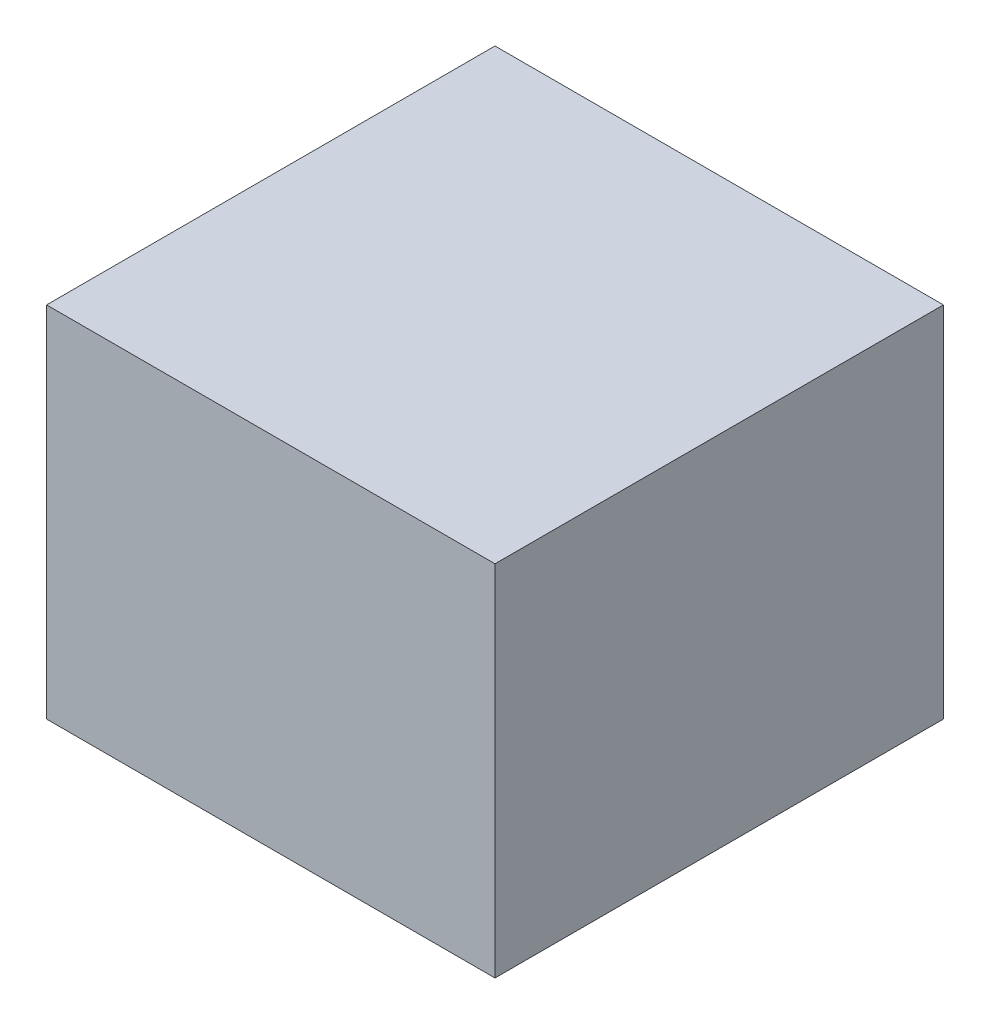
ISO-10303-21;
HEADER;
FILE_DESCRIPTION(('STEP AP214'),'2;1');
FILE_NAME('part.step','',(''),(''),'','','');
FILE_SCHEMA(('AUTOMOTIVE_DESIGN { 1 0 10303 214 1 1 1 1 }'));
ENDSEC;
DATA;
#1=APPLICATION_CONTEXT('core data for automotive mechanical design processes');
#2=APPLICATION_PROTOCOL_DEFINITION('international standard','automotive_design',2000,#1);
#3=PRODUCT_CONTEXT('',#1,'mechanical');
#4=PRODUCT('Part','Part','',(#3));
#5=PRODUCT_RELATED_PRODUCT_CATEGORY('part','',(#4));
#6=PRODUCT_DEFINITION_FORMATION('','',#4);
#7=PRODUCT_DEFINITION_CONTEXT('part definition',#1,'design');
#8=PRODUCT_DEFINITION('design','',#6,#7);
#9=PRODUCT_DEFINITION_SHAPE('','',#8);
#10=(LENGTH_UNIT() NAMED_UNIT(*) SI_UNIT(.MILLI.,.METRE.));
#11=(NAMED_UNIT(*) PLANE_ANGLE_UNIT() SI_UNIT($,.RADIAN.));
#12=(NAMED_UNIT(*) SI_UNIT($,.STERADIAN.) SOLID_ANGLE_UNIT());
#13=UNCERTAINTY_MEASURE_WITH_UNIT(LENGTH_MEASURE(1.E-05),#10,'distance_accuracy_value','');
#14=(GEOMETRIC_REPRESENTATION_CONTEXT(3) GLOBAL_UNCERTAINTY_ASSIGNED_CONTEXT((#13)) GLOBAL_UNIT_ASSIGNED_CONTEXT((#10,
#11,#12)) REPRESENTATION_CONTEXT('',''));
#15=CARTESIAN_POINT('',(0.,0.,0.));
#16=DIRECTION('',(0.,0.,1.));
#17=DIRECTION('',(1.,0.,0.));
#18=AXIS2_PLACEMENT_3D('',#15,#16,#17);
#19=CARTESIAN_POINT('',(-25.,40.,-25.));
#20=DIRECTION('',(1.,0.,0.));
#21=DIRECTION('',(0.,0.,-1.));
#22=AXIS2_PLACEMENT_3D('',#19,#20,#21);
#23=PLANE('',#22);
#24=DIRECTION('',(0.,0.,1.));
#25=VECTOR('',#24,1.);
#26=CARTESIAN_POINT('',(-25.,0.,-25.));
#27=LINE('',#26,#25);
#28=CARTESIAN_POINT('',(-25.,0.,-25.));
#29=VERTEX_POINT('',#28);
#30=CARTESIAN_POINT('',(-25.,0.,25.));
#31=VERTEX_POINT('',#30);
#32=EDGE_CURVE('E107',#29,#31,#27,.T.);
#33=ORIENTED_EDGE('',*,*,#32,.T.);
#34=DIRECTION('',(0.,-1.,0.));
#35=VECTOR('',#34,1.);
#36=CARTESIAN_POINT('',(-25.,40.,25.));
#37=LINE('',#36,#35);
#38=CARTESIAN_POINT('',(-25.,40.,25.));
#39=VERTEX_POINT('',#38);
#40=EDGE_CURVE('E11',#39,#31,#37,.T.);
#41=ORIENTED_EDGE('',*,*,#40,.F.);
#42=DIRECTION('',(0.,0.,1.));
#43=VECTOR('',#42,1.);
#44=CARTESIAN_POINT('',(-25.,40.,-25.));
#45=LINE('',#44,#43);
#46=CARTESIAN_POINT('',(-25.,40.,-25.));
#47=VERTEX_POINT('',#46);
#48=EDGE_CURVE('E92',#47,#39,#45,.T.);
#49=ORIENTED_EDGE('',*,*,#48,.F.);
#50=DIRECTION('',(0.,-1.,0.));
#51=VECTOR('',#50,1.);
#52=CARTESIAN_POINT('',(-25.,40.,-25.));
#53=LINE('',#52,#51);
#54=EDGE_CURVE('E105',#47,#29,#53,.T.);
#55=ORIENTED_EDGE('',*,*,#54,.T.);
#56=EDGE_LOOP('',(#33,#41,#49,#55));
#57=FACE_BOUND('',#56,.T.);
#58=ADVANCED_FACE('F43',(#57),#23,.F.);
#59=CARTESIAN_POINT('',(-25.,40.,25.));
#60=DIRECTION('',(0.,0.,-1.));
#61=DIRECTION('',(-1.,0.,0.));
#62=AXIS2_PLACEMENT_3D('',#59,#60,#61);
#63=PLANE('',#62);
#64=DIRECTION('',(1.,0.,0.));
#65=VECTOR('',#64,1.);
#66=CARTESIAN_POINT('',(-25.,0.,25.));
#67=LINE('',#66,#65);
#68=CARTESIAN_POINT('',(25.,0.,25.));
#69=VERTEX_POINT('',#68);
#70=EDGE_CURVE('E97',#31,#69,#67,.T.);
#71=ORIENTED_EDGE('',*,*,#70,.T.);
#72=DIRECTION('',(0.,-1.,0.));
#73=VECTOR('',#72,1.);
#74=CARTESIAN_POINT('',(25.,40.,25.));
#75=LINE('',#74,#73);
#76=CARTESIAN_POINT('',(25.,40.,25.));
#77=VERTEX_POINT('',#76);
#78=EDGE_CURVE('E51',#77,#69,#75,.T.);
#79=ORIENTED_EDGE('',*,*,#78,.F.);
#80=DIRECTION('',(1.,0.,0.));
#81=VECTOR('',#80,1.);
#82=CARTESIAN_POINT('',(-25.,40.,25.));
#83=LINE('',#82,#81);
#84=EDGE_CURVE('E87',#39,#77,#83,.T.);
#85=ORIENTED_EDGE('',*,*,#84,.F.);
#86=ORIENTED_EDGE('',*,*,#40,.T.);
#87=EDGE_LOOP('',(#71,#79,#85,#86));
#88=FACE_BOUND('',#87,.T.);
#89=ADVANCED_FACE('F100',(#88),#63,.F.);
#90=CARTESIAN_POINT('',(25.,40.,25.));
#91=DIRECTION('',(-1.,0.,0.));
#92=DIRECTION('',(0.,0.,1.));
#93=AXIS2_PLACEMENT_3D('',#90,#91,#92);
#94=PLANE('',#93);
#95=DIRECTION('',(0.,0.,-1.));
#96=VECTOR('',#95,1.);
#97=CARTESIAN_POINT('',(25.,0.,25.));
#98=LINE('',#97,#96);
#99=CARTESIAN_POINT('',(25.,0.,-25.));
#100=VERTEX_POINT('',#99);
#101=EDGE_CURVE('E78',#69,#100,#98,.T.);
#102=ORIENTED_EDGE('',*,*,#101,.T.);
#103=DIRECTION('',(0.,-1.,0.));
#104=VECTOR('',#103,1.);
#105=CARTESIAN_POINT('',(25.,40.,-25.));
#106=LINE('',#105,#104);
#107=CARTESIAN_POINT('',(25.,40.,-25.));
#108=VERTEX_POINT('',#107);
#109=EDGE_CURVE('E98',#108,#100,#106,.T.);
#110=ORIENTED_EDGE('',*,*,#109,.F.);
#111=DIRECTION('',(0.,0.,-1.));
#112=VECTOR('',#111,1.);
#113=CARTESIAN_POINT('',(25.,40.,25.));
#114=LINE('',#113,#112);
#115=EDGE_CURVE('E95',#77,#108,#114,.T.);
#116=ORIENTED_EDGE('',*,*,#115,.F.);
#117=ORIENTED_EDGE('',*,*,#78,.T.);
#118=EDGE_LOOP('',(#102,#110,#116,#117));
#119=FACE_BOUND('',#118,.T.);
#120=ADVANCED_FACE('F99',(#119),#94,.F.);
#121=CARTESIAN_POINT('',(25.,40.,-25.));
#122=DIRECTION('',(0.,0.,1.));
#123=DIRECTION('',(1.,0.,0.));
#124=AXIS2_PLACEMENT_3D('',#121,#122,#123);
#125=PLANE('',#124);
#126=DIRECTION('',(-1.,0.,0.));
#127=VECTOR('',#126,1.);
#128=CARTESIAN_POINT('',(25.,0.,-25.));
#129=LINE('',#128,#127);
#130=EDGE_CURVE('E85',#100,#29,#129,.T.);
#131=ORIENTED_EDGE('',*,*,#130,.T.);
#132=ORIENTED_EDGE('',*,*,#54,.F.);
#133=DIRECTION('',(-1.,0.,0.));
#134=VECTOR('',#133,1.);
#135=CARTESIAN_POINT('',(25.,40.,-25.));
#136=LINE('',#135,#134);
#137=EDGE_CURVE('E56',#108,#47,#136,.T.);
#138=ORIENTED_EDGE('',*,*,#137,.F.);
#139=ORIENTED_EDGE('',*,*,#109,.T.);
#140=EDGE_LOOP('',(#131,#132,#138,#139));
#141=FACE_BOUND('',#140,.T.);
#142=ADVANCED_FACE('F111',(#141),#125,.F.);
#143=CARTESIAN_POINT('',(0.,40.,0.));
#144=DIRECTION('',(0.,1.,0.));
#145=DIRECTION('',(0.,0.,1.));
#146=AXIS2_PLACEMENT_3D('',#143,#144,#145);
#147=PLANE('',#146);
#148=ORIENTED_EDGE('',*,*,#48,.T.);
#149=ORIENTED_EDGE('',*,*,#84,.T.);
#150=ORIENTED_EDGE('',*,*,#115,.T.);
#151=ORIENTED_EDGE('',*,*,#137,.T.);
#152=EDGE_LOOP('',(#148,#149,#150,#151));
#153=FACE_BOUND('',#152,.T.);
#154=ADVANCED_FACE('F89',(#153),#147,.T.);
#155=CARTESIAN_POINT('',(0.,0.,0.));
#156=DIRECTION('',(0.,1.,0.));
#157=DIRECTION('',(0.,0.,1.));
#158=AXIS2_PLACEMENT_3D('',#155,#156,#157);
#159=PLANE('',#158);
#160=ORIENTED_EDGE('',*,*,#32,.F.);
#161=ORIENTED_EDGE('',*,*,#130,.F.);
#162=ORIENTED_EDGE('',*,*,#101,.F.);
#163=ORIENTED_EDGE('',*,*,#70,.F.);
#164=EDGE_LOOP('',(#160,#161,#162,#163));
#165=FACE_BOUND('',#164,.T.);
#166=ADVANCED_FACE('F117',(#165),#159,.F.);
#167=CLOSED_SHELL('',(#58,#89,#120,#142,#154,#166));
#168=MANIFOLD_SOLID_BREP('B2',#167);
#169=ADVANCED_BREP_SHAPE_REPRESENTATION('',(#18,#168),#14);
#170=SHAPE_DEFINITION_REPRESENTATION(#9,#169);
ENDSEC;
END-ISO-10303-21;
